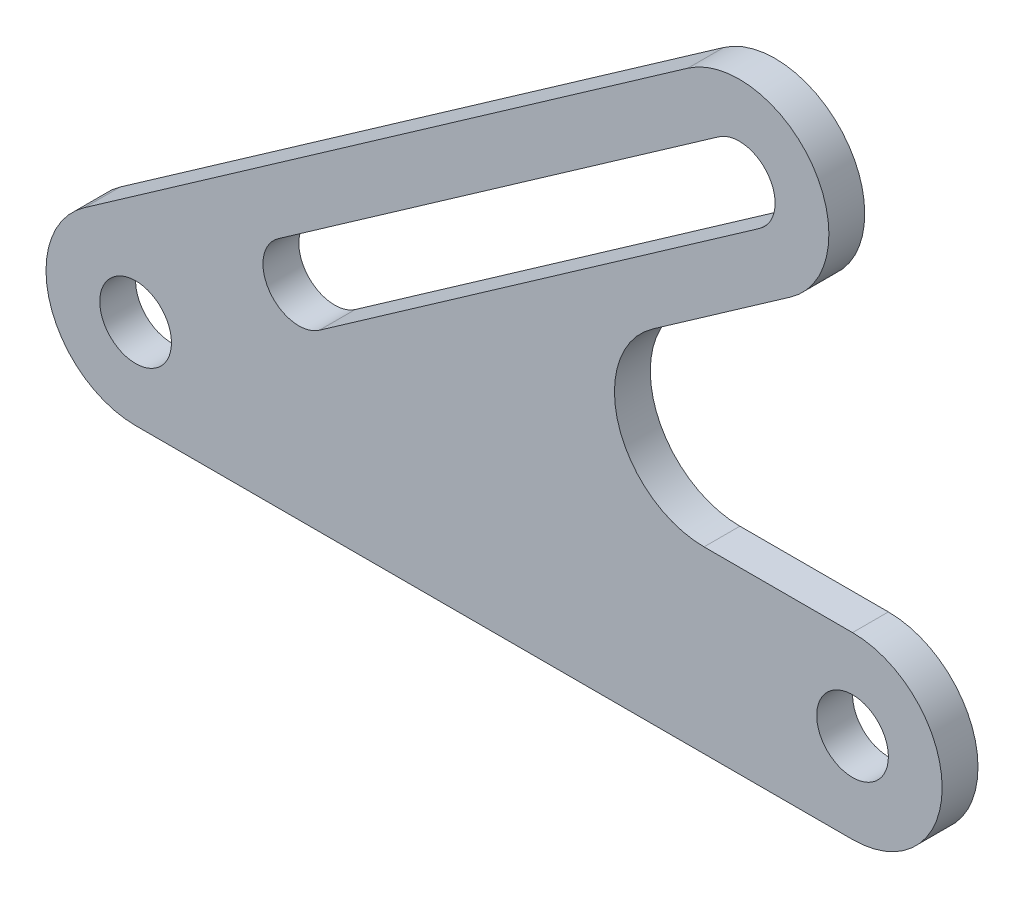
ISO-10303-21;
HEADER;
FILE_DESCRIPTION(('STEP AP214'),'2;1');
FILE_NAME('part.step','',(''),(''),'','','');
FILE_SCHEMA(('AUTOMOTIVE_DESIGN { 1 0 10303 214 1 1 1 1 }'));
ENDSEC;
DATA;
#1=APPLICATION_CONTEXT('core data for automotive mechanical design processes');
#2=APPLICATION_PROTOCOL_DEFINITION('international standard','automotive_design',2000,#1);
#3=PRODUCT_CONTEXT('',#1,'mechanical');
#4=PRODUCT('Part','Part','',(#3));
#5=PRODUCT_RELATED_PRODUCT_CATEGORY('part','',(#4));
#6=PRODUCT_DEFINITION_FORMATION('','',#4);
#7=PRODUCT_DEFINITION_CONTEXT('part definition',#1,'design');
#8=PRODUCT_DEFINITION('design','',#6,#7);
#9=PRODUCT_DEFINITION_SHAPE('','',#8);
#10=(LENGTH_UNIT() NAMED_UNIT(*) SI_UNIT(.MILLI.,.METRE.));
#11=(NAMED_UNIT(*) PLANE_ANGLE_UNIT() SI_UNIT($,.RADIAN.));
#12=(NAMED_UNIT(*) SI_UNIT($,.STERADIAN.) SOLID_ANGLE_UNIT());
#13=UNCERTAINTY_MEASURE_WITH_UNIT(LENGTH_MEASURE(1.E-05),#10,'distance_accuracy_value','');
#14=(GEOMETRIC_REPRESENTATION_CONTEXT(3) GLOBAL_UNCERTAINTY_ASSIGNED_CONTEXT((#13)) GLOBAL_UNIT_ASSIGNED_CONTEXT((#10,
#11,#12)) REPRESENTATION_CONTEXT('',''));
#15=CARTESIAN_POINT('',(0.,0.,0.));
#16=DIRECTION('',(0.,0.,1.));
#17=DIRECTION('',(1.,0.,0.));
#18=AXIS2_PLACEMENT_3D('',#15,#16,#17);
#19=CARTESIAN_POINT('',(-5.7357643635104,8.19152044288993,2.));
#20=DIRECTION('',(-0.573576436351042,0.819152044288995,0.));
#21=DIRECTION('',(-0.819152044288995,-0.573576436351042,0.));
#22=AXIS2_PLACEMENT_3D('',#19,#20,#21);
#23=PLANE('',#22);
#24=DIRECTION('',(0.819152044288995,0.573576436351042,0.));
#25=VECTOR('',#24,1.);
#26=CARTESIAN_POINT('',(-5.7357643635104,8.19152044288993,-2.));
#27=LINE('',#26,#25);
#28=CARTESIAN_POINT('',(-5.73576436351041,8.19152044288994,-2.));
#29=VERTEX_POINT('',#28);
#30=CARTESIAN_POINT('',(61.625847102543,55.3586285773736,-2.));
#31=VERTEX_POINT('',#30);
#32=EDGE_CURVE('E193',#29,#31,#27,.T.);
#33=ORIENTED_EDGE('',*,*,#32,.F.);
#34=DIRECTION('',(0.,0.,-1.));
#35=VECTOR('',#34,1.);
#36=CARTESIAN_POINT('',(-5.73576436351041,8.19152044288994,2.));
#37=LINE('',#36,#35);
#38=CARTESIAN_POINT('',(-5.73576436351041,8.19152044288994,2.));
#39=VERTEX_POINT('',#38);
#40=EDGE_CURVE('E259',#39,#29,#37,.T.);
#41=ORIENTED_EDGE('',*,*,#40,.F.);
#42=DIRECTION('',(0.819152044288995,0.573576436351042,0.));
#43=VECTOR('',#42,1.);
#44=CARTESIAN_POINT('',(-5.7357643635104,8.19152044288993,2.));
#45=LINE('',#44,#43);
#46=CARTESIAN_POINT('',(61.625847102543,55.3586285773736,2.));
#47=VERTEX_POINT('',#46);
#48=EDGE_CURVE('E194',#39,#47,#45,.T.);
#49=ORIENTED_EDGE('',*,*,#48,.T.);
#50=DIRECTION('',(0.,0.,-1.));
#51=VECTOR('',#50,1.);
#52=CARTESIAN_POINT('',(61.625847102543,55.3586285773736,2.));
#53=LINE('',#52,#51);
#54=EDGE_CURVE('E218',#47,#31,#53,.T.);
#55=ORIENTED_EDGE('',*,*,#54,.T.);
#56=EDGE_LOOP('',(#33,#41,#49,#55));
#57=FACE_BOUND('',#56,.T.);
#58=ADVANCED_FACE('F41',(#57),#23,.T.);
#59=CARTESIAN_POINT('',(0.,0.,2.));
#60=DIRECTION('',(0.,0.,-1.));
#61=DIRECTION('',(-1.,0.,0.));
#62=AXIS2_PLACEMENT_3D('',#59,#60,#61);
#63=CYLINDRICAL_SURFACE('',#62,10.);
#64=CARTESIAN_POINT('',(0.,0.,-2.));
#65=DIRECTION('',(0.,0.,1.));
#66=DIRECTION('',(1.,0.,0.));
#67=AXIS2_PLACEMENT_3D('',#64,#65,#66);
#68=CIRCLE('',#67,10.);
#69=CARTESIAN_POINT('',(0.,-10.,-2.));
#70=VERTEX_POINT('',#69);
#71=EDGE_CURVE('E222',#29,#70,#68,.T.);
#72=ORIENTED_EDGE('',*,*,#71,.T.);
#73=DIRECTION('',(0.,0.,-1.));
#74=VECTOR('',#73,1.);
#75=CARTESIAN_POINT('',(0.,-10.,2.));
#76=LINE('',#75,#74);
#77=CARTESIAN_POINT('',(0.,-10.,2.));
#78=VERTEX_POINT('',#77);
#79=EDGE_CURVE('E255',#78,#70,#76,.T.);
#80=ORIENTED_EDGE('',*,*,#79,.F.);
#81=CARTESIAN_POINT('',(0.,0.,2.));
#82=DIRECTION('',(0.,0.,1.));
#83=DIRECTION('',(1.,0.,0.));
#84=AXIS2_PLACEMENT_3D('',#81,#82,#83);
#85=CIRCLE('',#84,10.);
#86=EDGE_CURVE('E198',#39,#78,#85,.T.);
#87=ORIENTED_EDGE('',*,*,#86,.F.);
#88=ORIENTED_EDGE('',*,*,#40,.T.);
#89=EDGE_LOOP('',(#72,#80,#87,#88));
#90=FACE_BOUND('',#89,.T.);
#91=ADVANCED_FACE('F298',(#90),#63,.T.);
#92=CARTESIAN_POINT('',(0.,-10.,2.));
#93=DIRECTION('',(0.,1.,0.));
#94=DIRECTION('',(0.,0.,1.));
#95=AXIS2_PLACEMENT_3D('',#92,#93,#94);
#96=PLANE('',#95);
#97=DIRECTION('',(1.,0.,0.));
#98=VECTOR('',#97,1.);
#99=CARTESIAN_POINT('',(0.,-10.,-2.));
#100=LINE('',#99,#98);
#101=CARTESIAN_POINT('',(80.,-10.,-2.));
#102=VERTEX_POINT('',#101);
#103=EDGE_CURVE('E225',#70,#102,#100,.T.);
#104=ORIENTED_EDGE('',*,*,#103,.T.);
#105=DIRECTION('',(0.,0.,-1.));
#106=VECTOR('',#105,1.);
#107=CARTESIAN_POINT('',(80.,-10.,2.));
#108=LINE('',#107,#106);
#109=CARTESIAN_POINT('',(80.,-10.,2.));
#110=VERTEX_POINT('',#109);
#111=EDGE_CURVE('E251',#110,#102,#108,.T.);
#112=ORIENTED_EDGE('',*,*,#111,.F.);
#113=DIRECTION('',(1.,0.,0.));
#114=VECTOR('',#113,1.);
#115=CARTESIAN_POINT('',(0.,-10.,2.));
#116=LINE('',#115,#114);
#117=EDGE_CURVE('E202',#78,#110,#116,.T.);
#118=ORIENTED_EDGE('',*,*,#117,.F.);
#119=ORIENTED_EDGE('',*,*,#79,.T.);
#120=EDGE_LOOP('',(#104,#112,#118,#119));
#121=FACE_BOUND('',#120,.T.);
#122=ADVANCED_FACE('F303',(#121),#96,.F.);
#123=CARTESIAN_POINT('',(80.,0.,2.));
#124=DIRECTION('',(0.,0.,-1.));
#125=DIRECTION('',(-1.,0.,0.));
#126=AXIS2_PLACEMENT_3D('',#123,#124,#125);
#127=CYLINDRICAL_SURFACE('',#126,10.);
#128=CARTESIAN_POINT('',(80.,0.,-2.));
#129=DIRECTION('',(0.,0.,1.));
#130=DIRECTION('',(1.,0.,0.));
#131=AXIS2_PLACEMENT_3D('',#128,#129,#130);
#132=CIRCLE('',#131,10.);
#133=CARTESIAN_POINT('',(80.,10.,-2.));
#134=VERTEX_POINT('',#133);
#135=EDGE_CURVE('E228',#102,#134,#132,.T.);
#136=ORIENTED_EDGE('',*,*,#135,.T.);
#137=DIRECTION('',(0.,0.,-1.));
#138=VECTOR('',#137,1.);
#139=CARTESIAN_POINT('',(80.,10.,2.));
#140=LINE('',#139,#138);
#141=CARTESIAN_POINT('',(80.,10.,2.));
#142=VERTEX_POINT('',#141);
#143=EDGE_CURVE('E247',#142,#134,#140,.T.);
#144=ORIENTED_EDGE('',*,*,#143,.F.);
#145=CARTESIAN_POINT('',(80.,0.,2.));
#146=DIRECTION('',(0.,0.,1.));
#147=DIRECTION('',(1.,0.,0.));
#148=AXIS2_PLACEMENT_3D('',#145,#146,#147);
#149=CIRCLE('',#148,10.);
#150=EDGE_CURVE('E205',#110,#142,#149,.T.);
#151=ORIENTED_EDGE('',*,*,#150,.F.);
#152=ORIENTED_EDGE('',*,*,#111,.T.);
#153=EDGE_LOOP('',(#136,#144,#151,#152));
#154=FACE_BOUND('',#153,.T.);
#155=ADVANCED_FACE('F310',(#154),#127,.T.);
#156=CARTESIAN_POINT('',(0.,10.,2.));
#157=DIRECTION('',(0.,1.,0.));
#158=DIRECTION('',(0.,0.,1.));
#159=AXIS2_PLACEMENT_3D('',#156,#157,#158);
#160=PLANE('',#159);
#161=DIRECTION('',(1.,0.,0.));
#162=VECTOR('',#161,1.);
#163=CARTESIAN_POINT('',(0.,10.,-2.));
#164=LINE('',#163,#162);
#165=CARTESIAN_POINT('',(63.4318960472648,10.,-2.));
#166=VERTEX_POINT('',#165);
#167=EDGE_CURVE('E232',#166,#134,#164,.T.);
#168=ORIENTED_EDGE('',*,*,#167,.F.);
#169=DIRECTION('',(0.,0.,-1.));
#170=VECTOR('',#169,1.);
#171=CARTESIAN_POINT('',(63.4318960472648,10.,2.));
#172=LINE('',#171,#170);
#173=CARTESIAN_POINT('',(63.4318960472648,10.,2.));
#174=VERTEX_POINT('',#173);
#175=EDGE_CURVE('E57',#166,#174,#172,.F.);
#176=ORIENTED_EDGE('',*,*,#175,.T.);
#177=DIRECTION('',(1.,0.,0.));
#178=VECTOR('',#177,1.);
#179=CARTESIAN_POINT('',(0.,10.,2.));
#180=LINE('',#179,#178);
#181=EDGE_CURVE('E209',#174,#142,#180,.T.);
#182=ORIENTED_EDGE('',*,*,#181,.T.);
#183=ORIENTED_EDGE('',*,*,#143,.T.);
#184=EDGE_LOOP('',(#168,#176,#182,#183));
#185=FACE_BOUND('',#184,.T.);
#186=ADVANCED_FACE('F314',(#185),#160,.T.);
#187=CARTESIAN_POINT('',(5.73576436351041,-8.19152044288993,2.));
#188=DIRECTION('',(-0.573576436351042,0.819152044288995,0.));
#189=DIRECTION('',(-0.819152044288995,-0.573576436351042,0.));
#190=AXIS2_PLACEMENT_3D('',#187,#188,#189);
#191=PLANE('',#190);
#192=DIRECTION('',(0.819152044288995,0.573576436351042,0.));
#193=VECTOR('',#192,1.);
#194=CARTESIAN_POINT('',(5.73576436351041,-8.19152044288993,2.));
#195=LINE('',#194,#193);
#196=CARTESIAN_POINT('',(57.6961316837544,28.19152044289,2.));
#197=VERTEX_POINT('',#196);
#198=CARTESIAN_POINT('',(73.0973758295638,38.9755876915938,2.));
#199=VERTEX_POINT('',#198);
#200=EDGE_CURVE('E212',#197,#199,#195,.T.);
#201=ORIENTED_EDGE('',*,*,#200,.F.);
#202=DIRECTION('',(0.,0.,-1.));
#203=VECTOR('',#202,1.);
#204=CARTESIAN_POINT('',(57.6961316837544,28.19152044289,2.));
#205=LINE('',#204,#203);
#206=CARTESIAN_POINT('',(57.6961316837544,28.19152044289,-2.));
#207=VERTEX_POINT('',#206);
#208=EDGE_CURVE('E262',#197,#207,#205,.T.);
#209=ORIENTED_EDGE('',*,*,#208,.T.);
#210=DIRECTION('',(0.819152044288995,0.573576436351042,0.));
#211=VECTOR('',#210,1.);
#212=CARTESIAN_POINT('',(5.73576436351041,-8.19152044288993,-2.));
#213=LINE('',#212,#211);
#214=CARTESIAN_POINT('',(73.0973758295638,38.9755876915938,-2.));
#215=VERTEX_POINT('',#214);
#216=EDGE_CURVE('E235',#207,#215,#213,.T.);
#217=ORIENTED_EDGE('',*,*,#216,.T.);
#218=DIRECTION('',(0.,0.,-1.));
#219=VECTOR('',#218,1.);
#220=CARTESIAN_POINT('',(73.0973758295638,38.9755876915938,2.));
#221=LINE('',#220,#219);
#222=EDGE_CURVE('E243',#199,#215,#221,.T.);
#223=ORIENTED_EDGE('',*,*,#222,.F.);
#224=EDGE_LOOP('',(#201,#209,#217,#223));
#225=FACE_BOUND('',#224,.T.);
#226=ADVANCED_FACE('F318',(#225),#191,.F.);
#227=CARTESIAN_POINT('',(67.3616114660534,47.1671081344837,2.));
#228=DIRECTION('',(0.,0.,-1.));
#229=DIRECTION('',(-1.,0.,0.));
#230=AXIS2_PLACEMENT_3D('',#227,#228,#229);
#231=CYLINDRICAL_SURFACE('',#230,9.99999999999997);
#232=CARTESIAN_POINT('',(67.3616114660534,47.1671081344837,-2.));
#233=DIRECTION('',(0.,0.,1.));
#234=DIRECTION('',(1.,0.,0.));
#235=AXIS2_PLACEMENT_3D('',#232,#233,#234);
#236=CIRCLE('',#235,9.99999999999997);
#237=EDGE_CURVE('E199',#215,#31,#236,.T.);
#238=ORIENTED_EDGE('',*,*,#237,.T.);
#239=ORIENTED_EDGE('',*,*,#54,.F.);
#240=CARTESIAN_POINT('',(67.3616114660534,47.1671081344837,2.));
#241=DIRECTION('',(0.,0.,1.));
#242=DIRECTION('',(1.,0.,0.));
#243=AXIS2_PLACEMENT_3D('',#240,#241,#242);
#244=CIRCLE('',#243,9.99999999999997);
#245=EDGE_CURVE('E215',#199,#47,#244,.T.);
#246=ORIENTED_EDGE('',*,*,#245,.F.);
#247=ORIENTED_EDGE('',*,*,#222,.T.);
#248=EDGE_LOOP('',(#238,#239,#246,#247));
#249=FACE_BOUND('',#248,.T.);
#250=ADVANCED_FACE('F321',(#249),#231,.T.);
#251=CARTESIAN_POINT('',(0.,0.,2.));
#252=DIRECTION('',(0.,0.,1.));
#253=DIRECTION('',(1.,0.,0.));
#254=AXIS2_PLACEMENT_3D('',#251,#252,#253);
#255=PLANE('',#254);
#256=CARTESIAN_POINT('',(80.,0.,2.));
#257=DIRECTION('',(0.,0.,1.));
#258=DIRECTION('',(1.,0.,0.));
#259=AXIS2_PLACEMENT_3D('',#256,#257,#258);
#260=CIRCLE('',#259,4.00000000000001);
#261=CARTESIAN_POINT('',(84.,0.,2.));
#262=VERTEX_POINT('',#261);
#263=EDGE_CURVE('E189',#262,#262,#260,.F.);
#264=ORIENTED_EDGE('',*,*,#263,.T.);
#265=EDGE_LOOP('',(#264));
#266=FACE_BOUND('',#265,.T.);
#267=DIRECTION('',(0.819152044288995,0.573576436351042,0.));
#268=VECTOR('',#267,1.);
#269=CARTESIAN_POINT('',(-2.29430574540416,3.27660817715596,2.));
#270=LINE('',#269,#268);
#271=CARTESIAN_POINT('',(15.9181830633096,16.0291301305772,2.));
#272=VERTEX_POINT('',#271);
#273=CARTESIAN_POINT('',(65.0673057206493,50.4437163116397,2.));
#274=VERTEX_POINT('',#273);
#275=EDGE_CURVE('E181',#272,#274,#270,.T.);
#276=ORIENTED_EDGE('',*,*,#275,.T.);
#277=CARTESIAN_POINT('',(67.3616114660534,47.1671081344837,2.));
#278=DIRECTION('',(0.,0.,1.));
#279=DIRECTION('',(1.,0.,0.));
#280=AXIS2_PLACEMENT_3D('',#277,#278,#279);
#281=CIRCLE('',#280,4.00000000000002);
#282=CARTESIAN_POINT('',(69.6559172114576,43.8904999573277,2.));
#283=VERTEX_POINT('',#282);
#284=EDGE_CURVE('E185',#274,#283,#281,.F.);
#285=ORIENTED_EDGE('',*,*,#284,.T.);
#286=DIRECTION('',(0.819152044288995,0.573576436351041,0.));
#287=VECTOR('',#286,1.);
#288=CARTESIAN_POINT('',(2.29430574540416,-3.27660817715598,2.));
#289=LINE('',#288,#287);
#290=CARTESIAN_POINT('',(20.5067945541179,9.4759137762652,2.));
#291=VERTEX_POINT('',#290);
#292=EDGE_CURVE('E176',#291,#283,#289,.T.);
#293=ORIENTED_EDGE('',*,*,#292,.F.);
#294=CARTESIAN_POINT('',(18.2124888087137,12.7525219534212,2.));
#295=DIRECTION('',(0.,0.,1.));
#296=DIRECTION('',(1.,0.,0.));
#297=AXIS2_PLACEMENT_3D('',#294,#295,#296);
#298=CIRCLE('',#297,4.);
#299=EDGE_CURVE('E137',#291,#272,#298,.F.);
#300=ORIENTED_EDGE('',*,*,#299,.T.);
#301=EDGE_LOOP('',(#276,#285,#293,#300));
#302=FACE_BOUND('',#301,.T.);
#303=CARTESIAN_POINT('',(0.,0.,2.));
#304=DIRECTION('',(0.,0.,1.));
#305=DIRECTION('',(1.,0.,0.));
#306=AXIS2_PLACEMENT_3D('',#303,#304,#305);
#307=CIRCLE('',#306,4.);
#308=CARTESIAN_POINT('',(4.,0.,2.));
#309=VERTEX_POINT('',#308);
#310=EDGE_CURVE('E172',#309,#309,#307,.F.);
#311=ORIENTED_EDGE('',*,*,#310,.T.);
#312=EDGE_LOOP('',(#311));
#313=FACE_BOUND('',#312,.T.);
#314=ORIENTED_EDGE('',*,*,#48,.F.);
#315=ORIENTED_EDGE('',*,*,#86,.T.);
#316=ORIENTED_EDGE('',*,*,#117,.T.);
#317=ORIENTED_EDGE('',*,*,#150,.T.);
#318=ORIENTED_EDGE('',*,*,#181,.F.);
#319=CARTESIAN_POINT('',(63.4318960472648,20.,2.));
#320=DIRECTION('',(0.,0.,1.));
#321=DIRECTION('',(1.,0.,0.));
#322=AXIS2_PLACEMENT_3D('',#319,#320,#321);
#323=CIRCLE('',#322,10.);
#324=EDGE_CURVE('E11',#174,#197,#323,.F.);
#325=ORIENTED_EDGE('',*,*,#324,.T.);
#326=ORIENTED_EDGE('',*,*,#200,.T.);
#327=ORIENTED_EDGE('',*,*,#245,.T.);
#328=EDGE_LOOP('',(#314,#315,#316,#317,#318,#325,#326,#327));
#329=FACE_BOUND('',#328,.T.);
#330=ADVANCED_FACE('F282',(#266,#302,#313,#329),#255,.T.);
#331=CARTESIAN_POINT('',(0.,0.,-2.));
#332=DIRECTION('',(0.,0.,1.));
#333=DIRECTION('',(1.,0.,0.));
#334=AXIS2_PLACEMENT_3D('',#331,#332,#333);
#335=PLANE('',#334);
#336=CARTESIAN_POINT('',(80.,0.,-2.));
#337=DIRECTION('',(0.,0.,1.));
#338=DIRECTION('',(1.,0.,0.));
#339=AXIS2_PLACEMENT_3D('',#336,#337,#338);
#340=CIRCLE('',#339,4.00000000000001);
#341=CARTESIAN_POINT('',(84.,0.,-2.));
#342=VERTEX_POINT('',#341);
#343=EDGE_CURVE('E166',#342,#342,#340,.T.);
#344=ORIENTED_EDGE('',*,*,#343,.T.);
#345=EDGE_LOOP('',(#344));
#346=FACE_BOUND('',#345,.T.);
#347=CARTESIAN_POINT('',(67.3616114660534,47.1671081344837,-2.));
#348=DIRECTION('',(0.,0.,1.));
#349=DIRECTION('',(1.,0.,0.));
#350=AXIS2_PLACEMENT_3D('',#347,#348,#349);
#351=CIRCLE('',#350,4.00000000000002);
#352=CARTESIAN_POINT('',(69.6559172114576,43.8904999573277,-2.));
#353=VERTEX_POINT('',#352);
#354=CARTESIAN_POINT('',(65.0673057206493,50.4437163116397,-2.));
#355=VERTEX_POINT('',#354);
#356=EDGE_CURVE('E160',#353,#355,#351,.T.);
#357=ORIENTED_EDGE('',*,*,#356,.T.);
#358=DIRECTION('',(-0.819152044288995,-0.573576436351042,0.));
#359=VECTOR('',#358,1.);
#360=CARTESIAN_POINT('',(65.0673057206493,50.4437163116397,-2.));
#361=LINE('',#360,#359);
#362=CARTESIAN_POINT('',(15.9181830633096,16.0291301305772,-2.));
#363=VERTEX_POINT('',#362);
#364=EDGE_CURVE('E156',#355,#363,#361,.T.);
#365=ORIENTED_EDGE('',*,*,#364,.T.);
#366=CARTESIAN_POINT('',(18.2124888087137,12.7525219534212,-2.));
#367=DIRECTION('',(0.,0.,1.));
#368=DIRECTION('',(1.,0.,0.));
#369=AXIS2_PLACEMENT_3D('',#366,#367,#368);
#370=CIRCLE('',#369,4.);
#371=CARTESIAN_POINT('',(20.5067945541179,9.4759137762652,-2.));
#372=VERTEX_POINT('',#371);
#373=EDGE_CURVE('E134',#363,#372,#370,.T.);
#374=ORIENTED_EDGE('',*,*,#373,.T.);
#375=DIRECTION('',(-0.819152044288995,-0.573576436351041,0.));
#376=VECTOR('',#375,1.);
#377=CARTESIAN_POINT('',(69.6559172114576,43.8904999573277,-2.));
#378=LINE('',#377,#376);
#379=EDGE_CURVE('E146',#353,#372,#378,.T.);
#380=ORIENTED_EDGE('',*,*,#379,.F.);
#381=EDGE_LOOP('',(#357,#365,#374,#380));
#382=FACE_BOUND('',#381,.T.);
#383=CARTESIAN_POINT('',(0.,0.,-2.));
#384=DIRECTION('',(0.,0.,1.));
#385=DIRECTION('',(1.,0.,0.));
#386=AXIS2_PLACEMENT_3D('',#383,#384,#385);
#387=CIRCLE('',#386,4.);
#388=CARTESIAN_POINT('',(4.,0.,-2.));
#389=VERTEX_POINT('',#388);
#390=EDGE_CURVE('E167',#389,#389,#387,.T.);
#391=ORIENTED_EDGE('',*,*,#390,.T.);
#392=EDGE_LOOP('',(#391));
#393=FACE_BOUND('',#392,.T.);
#394=ORIENTED_EDGE('',*,*,#32,.T.);
#395=ORIENTED_EDGE('',*,*,#237,.F.);
#396=ORIENTED_EDGE('',*,*,#216,.F.);
#397=CARTESIAN_POINT('',(63.4318960472648,20.,-2.));
#398=DIRECTION('',(0.,0.,1.));
#399=DIRECTION('',(1.,0.,0.));
#400=AXIS2_PLACEMENT_3D('',#397,#398,#399);
#401=CIRCLE('',#400,10.);
#402=EDGE_CURVE('E50',#207,#166,#401,.T.);
#403=ORIENTED_EDGE('',*,*,#402,.T.);
#404=ORIENTED_EDGE('',*,*,#167,.T.);
#405=ORIENTED_EDGE('',*,*,#135,.F.);
#406=ORIENTED_EDGE('',*,*,#103,.F.);
#407=ORIENTED_EDGE('',*,*,#71,.F.);
#408=EDGE_LOOP('',(#394,#395,#396,#403,#404,#405,#406,#407));
#409=FACE_BOUND('',#408,.T.);
#410=ADVANCED_FACE('F153',(#346,#382,#393,#409),#335,.F.);
#411=CARTESIAN_POINT('',(0.,0.,4.));
#412=DIRECTION('',(0.,0.,-1.));
#413=DIRECTION('',(-1.,0.,0.));
#414=AXIS2_PLACEMENT_3D('',#411,#412,#413);
#415=CYLINDRICAL_SURFACE('',#414,4.);
#416=ORIENTED_EDGE('',*,*,#310,.F.);
#417=EDGE_LOOP('',(#416));
#418=FACE_BOUND('',#417,.T.);
#419=ORIENTED_EDGE('',*,*,#390,.F.);
#420=EDGE_LOOP('',(#419));
#421=FACE_BOUND('',#420,.T.);
#422=ADVANCED_FACE('F287',(#418,#421),#415,.F.);
#423=CARTESIAN_POINT('',(67.3616114660534,47.1671081344837,4.));
#424=DIRECTION('',(0.,0.,-1.));
#425=DIRECTION('',(-1.,0.,0.));
#426=AXIS2_PLACEMENT_3D('',#423,#424,#425);
#427=CYLINDRICAL_SURFACE('',#426,4.00000000000002);
#428=DIRECTION('',(0.,0.,-1.));
#429=VECTOR('',#428,1.);
#430=CARTESIAN_POINT('',(65.0673057206493,50.4437163116397,4.));
#431=LINE('',#430,#429);
#432=EDGE_CURVE('E171',#274,#355,#431,.T.);
#433=ORIENTED_EDGE('',*,*,#432,.T.);
#434=ORIENTED_EDGE('',*,*,#356,.F.);
#435=DIRECTION('',(0.,0.,-1.));
#436=VECTOR('',#435,1.);
#437=CARTESIAN_POINT('',(69.6559172114576,43.8904999573277,4.));
#438=LINE('',#437,#436);
#439=EDGE_CURVE('E141',#283,#353,#438,.T.);
#440=ORIENTED_EDGE('',*,*,#439,.F.);
#441=ORIENTED_EDGE('',*,*,#284,.F.);
#442=EDGE_LOOP('',(#433,#434,#440,#441));
#443=FACE_BOUND('',#442,.T.);
#444=ADVANCED_FACE('F285',(#443),#427,.F.);
#445=CARTESIAN_POINT('',(65.0673057206493,50.4437163116397,4.));
#446=DIRECTION('',(0.573576436351042,-0.819152044288995,0.));
#447=DIRECTION('',(0.819152044288995,0.573576436351042,0.));
#448=AXIS2_PLACEMENT_3D('',#445,#446,#447);
#449=PLANE('',#448);
#450=DIRECTION('',(0.,0.,-1.));
#451=VECTOR('',#450,1.);
#452=CARTESIAN_POINT('',(15.9181830633096,16.0291301305772,4.));
#453=LINE('',#452,#451);
#454=EDGE_CURVE('E142',#272,#363,#453,.T.);
#455=ORIENTED_EDGE('',*,*,#454,.T.);
#456=ORIENTED_EDGE('',*,*,#364,.F.);
#457=ORIENTED_EDGE('',*,*,#432,.F.);
#458=ORIENTED_EDGE('',*,*,#275,.F.);
#459=EDGE_LOOP('',(#455,#456,#457,#458));
#460=FACE_BOUND('',#459,.T.);
#461=ADVANCED_FACE('F279',(#460),#449,.T.);
#462=CARTESIAN_POINT('',(18.2124888087137,12.7525219534212,4.));
#463=DIRECTION('',(0.,0.,-1.));
#464=DIRECTION('',(-1.,0.,0.));
#465=AXIS2_PLACEMENT_3D('',#462,#463,#464);
#466=CYLINDRICAL_SURFACE('',#465,4.);
#467=DIRECTION('',(0.,0.,-1.));
#468=VECTOR('',#467,1.);
#469=CARTESIAN_POINT('',(20.5067945541179,9.4759137762652,4.));
#470=LINE('',#469,#468);
#471=EDGE_CURVE('E129',#291,#372,#470,.T.);
#472=ORIENTED_EDGE('',*,*,#471,.T.);
#473=ORIENTED_EDGE('',*,*,#373,.F.);
#474=ORIENTED_EDGE('',*,*,#454,.F.);
#475=ORIENTED_EDGE('',*,*,#299,.F.);
#476=EDGE_LOOP('',(#472,#473,#474,#475));
#477=FACE_BOUND('',#476,.T.);
#478=ADVANCED_FACE('F131',(#477),#466,.F.);
#479=CARTESIAN_POINT('',(69.6559172114576,43.8904999573277,4.));
#480=DIRECTION('',(0.573576436351041,-0.819152044288995,0.));
#481=DIRECTION('',(0.819152044288995,0.573576436351041,0.));
#482=AXIS2_PLACEMENT_3D('',#479,#480,#481);
#483=PLANE('',#482);
#484=ORIENTED_EDGE('',*,*,#292,.T.);
#485=ORIENTED_EDGE('',*,*,#439,.T.);
#486=ORIENTED_EDGE('',*,*,#379,.T.);
#487=ORIENTED_EDGE('',*,*,#471,.F.);
#488=EDGE_LOOP('',(#484,#485,#486,#487));
#489=FACE_BOUND('',#488,.T.);
#490=ADVANCED_FACE('F147',(#489),#483,.F.);
#491=CARTESIAN_POINT('',(80.,0.,4.));
#492=DIRECTION('',(0.,0.,-1.));
#493=DIRECTION('',(-1.,0.,0.));
#494=AXIS2_PLACEMENT_3D('',#491,#492,#493);
#495=CYLINDRICAL_SURFACE('',#494,4.00000000000001);
#496=ORIENTED_EDGE('',*,*,#263,.F.);
#497=EDGE_LOOP('',(#496));
#498=FACE_BOUND('',#497,.T.);
#499=ORIENTED_EDGE('',*,*,#343,.F.);
#500=EDGE_LOOP('',(#499));
#501=FACE_BOUND('',#500,.T.);
#502=ADVANCED_FACE('F333',(#498,#501),#495,.F.);
#503=CARTESIAN_POINT('',(63.4318960472648,20.,2.));
#504=DIRECTION('',(0.,0.,-1.));
#505=DIRECTION('',(-1.,0.,0.));
#506=AXIS2_PLACEMENT_3D('',#503,#504,#505);
#507=CYLINDRICAL_SURFACE('',#506,10.);
#508=ORIENTED_EDGE('',*,*,#324,.F.);
#509=ORIENTED_EDGE('',*,*,#175,.F.);
#510=ORIENTED_EDGE('',*,*,#402,.F.);
#511=ORIENTED_EDGE('',*,*,#208,.F.);
#512=EDGE_LOOP('',(#508,#509,#510,#511));
#513=FACE_BOUND('',#512,.T.);
#514=ADVANCED_FACE('F43',(#513),#507,.F.);
#515=CLOSED_SHELL('',(#58,#91,#122,#155,#186,#226,#250,#330,#410,#422,#444,#461,#478,#490,#502,#514));
#516=MANIFOLD_SOLID_BREP('B2',#515);
#517=ADVANCED_BREP_SHAPE_REPRESENTATION('',(#18,#516),#14);
#518=SHAPE_DEFINITION_REPRESENTATION(#9,#517);
ENDSEC;
END-ISO-10303-21;
